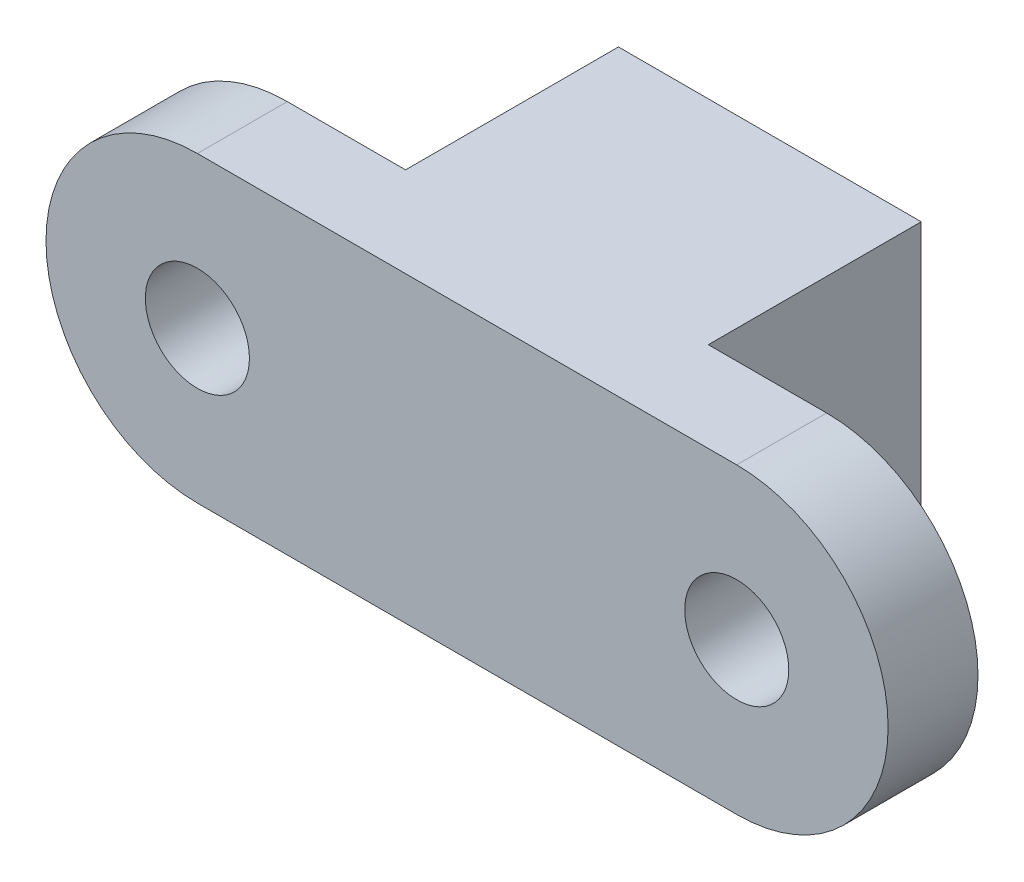
ISO-10303-21;
HEADER;
FILE_DESCRIPTION(('STEP AP214'),'2;1');
FILE_NAME('part.step','',(''),(''),'','','');
FILE_SCHEMA(('AUTOMOTIVE_DESIGN { 1 0 10303 214 1 1 1 1 }'));
ENDSEC;
DATA;
#1=APPLICATION_CONTEXT('core data for automotive mechanical design processes');
#2=APPLICATION_PROTOCOL_DEFINITION('international standard','automotive_design',2000,#1);
#3=PRODUCT_CONTEXT('',#1,'mechanical');
#4=PRODUCT('Part','Part','',(#3));
#5=PRODUCT_RELATED_PRODUCT_CATEGORY('part','',(#4));
#6=PRODUCT_DEFINITION_FORMATION('','',#4);
#7=PRODUCT_DEFINITION_CONTEXT('part definition',#1,'design');
#8=PRODUCT_DEFINITION('design','',#6,#7);
#9=PRODUCT_DEFINITION_SHAPE('','',#8);
#10=(LENGTH_UNIT() NAMED_UNIT(*) SI_UNIT(.MILLI.,.METRE.));
#11=(NAMED_UNIT(*) PLANE_ANGLE_UNIT() SI_UNIT($,.RADIAN.));
#12=(NAMED_UNIT(*) SI_UNIT($,.STERADIAN.) SOLID_ANGLE_UNIT());
#13=UNCERTAINTY_MEASURE_WITH_UNIT(LENGTH_MEASURE(1.E-05),#10,'distance_accuracy_value','');
#14=(GEOMETRIC_REPRESENTATION_CONTEXT(3) GLOBAL_UNCERTAINTY_ASSIGNED_CONTEXT((#13)) GLOBAL_UNIT_ASSIGNED_CONTEXT((#10,
#11,#12)) REPRESENTATION_CONTEXT('',''));
#15=CARTESIAN_POINT('',(0.,0.,0.));
#16=DIRECTION('',(0.,0.,1.));
#17=DIRECTION('',(1.,0.,0.));
#18=AXIS2_PLACEMENT_3D('',#15,#16,#17);
#19=CARTESIAN_POINT('',(0.,-32.,19.));
#20=DIRECTION('',(0.,1.,0.));
#21=DIRECTION('',(0.,0.,1.));
#22=AXIS2_PLACEMENT_3D('',#19,#20,#21);
#23=PLANE('',#22);
#24=DIRECTION('',(0.,0.,-1.));
#25=VECTOR('',#24,1.);
#26=CARTESIAN_POINT('',(38.,-32.,6.));
#27=LINE('',#26,#25);
#28=CARTESIAN_POINT('',(38.,-32.,6.));
#29=VERTEX_POINT('',#28);
#30=CARTESIAN_POINT('',(38.,-32.,-45.));
#31=VERTEX_POINT('',#30);
#32=EDGE_CURVE('E122',#29,#31,#27,.T.);
#33=ORIENTED_EDGE('',*,*,#32,.F.);
#34=DIRECTION('',(1.,0.,0.));
#35=VECTOR('',#34,1.);
#36=CARTESIAN_POINT('',(38.,-32.,6.));
#37=LINE('',#36,#35);
#38=CARTESIAN_POINT('',(76.,-32.,6.));
#39=VERTEX_POINT('',#38);
#40=EDGE_CURVE('E157',#29,#39,#37,.T.);
#41=ORIENTED_EDGE('',*,*,#40,.T.);
#42=DIRECTION('',(0.,0.,-1.));
#43=VECTOR('',#42,1.);
#44=CARTESIAN_POINT('',(76.,-32.,6.));
#45=LINE('',#44,#43);
#46=CARTESIAN_POINT('',(76.,-32.,-45.));
#47=VERTEX_POINT('',#46);
#48=EDGE_CURVE('E233',#39,#47,#45,.T.);
#49=ORIENTED_EDGE('',*,*,#48,.T.);
#50=DIRECTION('',(-1.,0.,0.));
#51=VECTOR('',#50,1.);
#52=CARTESIAN_POINT('',(25.,-32.,-45.));
#53=LINE('',#52,#51);
#54=CARTESIAN_POINT('',(89.,-32.,-45.));
#55=VERTEX_POINT('',#54);
#56=EDGE_CURVE('E143',#55,#47,#53,.T.);
#57=ORIENTED_EDGE('',*,*,#56,.F.);
#58=DIRECTION('',(0.,0.,1.));
#59=VECTOR('',#58,1.);
#60=CARTESIAN_POINT('',(89.,-32.,-45.));
#61=LINE('',#60,#59);
#62=CARTESIAN_POINT('',(89.,-32.,0.));
#63=VERTEX_POINT('',#62);
#64=EDGE_CURVE('E162',#55,#63,#61,.T.);
#65=ORIENTED_EDGE('',*,*,#64,.T.);
#66=DIRECTION('',(1.,0.,0.));
#67=VECTOR('',#66,1.);
#68=CARTESIAN_POINT('',(0.,-32.,0.));
#69=LINE('',#68,#67);
#70=CARTESIAN_POINT('',(114.,-32.,0.));
#71=VERTEX_POINT('',#70);
#72=EDGE_CURVE('E194',#63,#71,#69,.T.);
#73=ORIENTED_EDGE('',*,*,#72,.T.);
#74=DIRECTION('',(0.,0.,-1.));
#75=VECTOR('',#74,1.);
#76=CARTESIAN_POINT('',(114.,-32.,19.));
#77=LINE('',#76,#75);
#78=CARTESIAN_POINT('',(114.,-32.,19.));
#79=VERTEX_POINT('',#78);
#80=EDGE_CURVE('E47',#79,#71,#77,.T.);
#81=ORIENTED_EDGE('',*,*,#80,.F.);
#82=DIRECTION('',(1.,0.,0.));
#83=VECTOR('',#82,1.);
#84=CARTESIAN_POINT('',(0.,-32.,19.));
#85=LINE('',#84,#83);
#86=CARTESIAN_POINT('',(0.,-32.,19.));
#87=VERTEX_POINT('',#86);
#88=EDGE_CURVE('E184',#87,#79,#85,.T.);
#89=ORIENTED_EDGE('',*,*,#88,.F.);
#90=DIRECTION('',(0.,0.,-1.));
#91=VECTOR('',#90,1.);
#92=CARTESIAN_POINT('',(0.,-32.,19.));
#93=LINE('',#92,#91);
#94=CARTESIAN_POINT('',(0.,-32.,0.));
#95=VERTEX_POINT('',#94);
#96=EDGE_CURVE('E11',#87,#95,#93,.T.);
#97=ORIENTED_EDGE('',*,*,#96,.T.);
#98=CARTESIAN_POINT('',(25.,-32.,0.));
#99=VERTEX_POINT('',#98);
#100=EDGE_CURVE('E195',#95,#99,#69,.T.);
#101=ORIENTED_EDGE('',*,*,#100,.T.);
#102=DIRECTION('',(0.,0.,1.));
#103=VECTOR('',#102,1.);
#104=CARTESIAN_POINT('',(25.,-32.,-45.));
#105=LINE('',#104,#103);
#106=CARTESIAN_POINT('',(25.,-32.,-45.));
#107=VERTEX_POINT('',#106);
#108=EDGE_CURVE('E141',#107,#99,#105,.T.);
#109=ORIENTED_EDGE('',*,*,#108,.F.);
#110=EDGE_CURVE('E135',#31,#107,#53,.T.);
#111=ORIENTED_EDGE('',*,*,#110,.F.);
#112=EDGE_LOOP('',(#33,#41,#49,#57,#65,#73,#81,#89,#97,#101,#109,#111));
#113=FACE_BOUND('',#112,.T.);
#114=ADVANCED_FACE('F39',(#113),#23,.F.);
#115=CARTESIAN_POINT('',(0.,0.,-45.));
#116=DIRECTION('',(0.,0.,1.));
#117=DIRECTION('',(1.,0.,0.));
#118=AXIS2_PLACEMENT_3D('',#115,#116,#117);
#119=PLANE('',#118);
#120=DIRECTION('',(0.,1.,0.));
#121=VECTOR('',#120,1.);
#122=CARTESIAN_POINT('',(38.,-32.,-45.));
#123=LINE('',#122,#121);
#124=CARTESIAN_POINT('',(38.,19.,-45.));
#125=VERTEX_POINT('',#124);
#126=EDGE_CURVE('E125',#31,#125,#123,.T.);
#127=ORIENTED_EDGE('',*,*,#126,.F.);
#128=ORIENTED_EDGE('',*,*,#110,.T.);
#129=DIRECTION('',(0.,1.,0.));
#130=VECTOR('',#129,1.);
#131=CARTESIAN_POINT('',(25.,32.,-45.));
#132=LINE('',#131,#130);
#133=CARTESIAN_POINT('',(25.,32.,-45.));
#134=VERTEX_POINT('',#133);
#135=EDGE_CURVE('E147',#107,#134,#132,.T.);
#136=ORIENTED_EDGE('',*,*,#135,.T.);
#137=DIRECTION('',(1.,0.,0.));
#138=VECTOR('',#137,1.);
#139=CARTESIAN_POINT('',(89.,32.,-45.));
#140=LINE('',#139,#138);
#141=CARTESIAN_POINT('',(89.,32.,-45.));
#142=VERTEX_POINT('',#141);
#143=EDGE_CURVE('E148',#134,#142,#140,.T.);
#144=ORIENTED_EDGE('',*,*,#143,.T.);
#145=DIRECTION('',(0.,-1.,0.));
#146=VECTOR('',#145,1.);
#147=CARTESIAN_POINT('',(89.,32.,-45.));
#148=LINE('',#147,#146);
#149=EDGE_CURVE('E144',#142,#55,#148,.T.);
#150=ORIENTED_EDGE('',*,*,#149,.T.);
#151=ORIENTED_EDGE('',*,*,#56,.T.);
#152=DIRECTION('',(0.,1.,0.));
#153=VECTOR('',#152,1.);
#154=CARTESIAN_POINT('',(76.,-32.,-45.));
#155=LINE('',#154,#153);
#156=CARTESIAN_POINT('',(76.,19.,-45.));
#157=VERTEX_POINT('',#156);
#158=EDGE_CURVE('E231',#47,#157,#155,.T.);
#159=ORIENTED_EDGE('',*,*,#158,.T.);
#160=DIRECTION('',(1.,0.,0.));
#161=VECTOR('',#160,1.);
#162=CARTESIAN_POINT('',(38.,19.,-45.));
#163=LINE('',#162,#161);
#164=EDGE_CURVE('E138',#125,#157,#163,.T.);
#165=ORIENTED_EDGE('',*,*,#164,.F.);
#166=EDGE_LOOP('',(#127,#128,#136,#144,#150,#151,#159,#165));
#167=FACE_BOUND('',#166,.T.);
#168=ADVANCED_FACE('F134',(#167),#119,.F.);
#169=CARTESIAN_POINT('',(0.,0.,0.));
#170=DIRECTION('',(0.,0.,1.));
#171=DIRECTION('',(1.,0.,0.));
#172=AXIS2_PLACEMENT_3D('',#169,#170,#171);
#173=PLANE('',#172);
#174=CARTESIAN_POINT('',(0.,0.,0.));
#175=DIRECTION('',(0.,0.,1.));
#176=DIRECTION('',(1.,0.,0.));
#177=AXIS2_PLACEMENT_3D('',#174,#175,#176);
#178=CIRCLE('',#177,11.);
#179=CARTESIAN_POINT('',(11.,0.,0.));
#180=VERTEX_POINT('',#179);
#181=EDGE_CURVE('E172',#180,#180,#178,.T.);
#182=ORIENTED_EDGE('',*,*,#181,.T.);
#183=EDGE_LOOP('',(#182));
#184=FACE_BOUND('',#183,.T.);
#185=DIRECTION('',(0.,1.,0.));
#186=VECTOR('',#185,1.);
#187=CARTESIAN_POINT('',(25.,32.,0.));
#188=LINE('',#187,#186);
#189=CARTESIAN_POINT('',(25.,32.,0.));
#190=VERTEX_POINT('',#189);
#191=EDGE_CURVE('E62',#99,#190,#188,.T.);
#192=ORIENTED_EDGE('',*,*,#191,.F.);
#193=ORIENTED_EDGE('',*,*,#100,.F.);
#194=CARTESIAN_POINT('',(0.,0.,0.));
#195=DIRECTION('',(0.,0.,1.));
#196=DIRECTION('',(1.,0.,0.));
#197=AXIS2_PLACEMENT_3D('',#194,#195,#196);
#198=CIRCLE('',#197,32.);
#199=CARTESIAN_POINT('',(0.,32.,0.));
#200=VERTEX_POINT('',#199);
#201=EDGE_CURVE('E178',#200,#95,#198,.T.);
#202=ORIENTED_EDGE('',*,*,#201,.F.);
#203=DIRECTION('',(-1.,0.,0.));
#204=VECTOR('',#203,1.);
#205=CARTESIAN_POINT('',(0.,32.,0.));
#206=LINE('',#205,#204);
#207=EDGE_CURVE('E199',#190,#200,#206,.T.);
#208=ORIENTED_EDGE('',*,*,#207,.F.);
#209=EDGE_LOOP('',(#192,#193,#202,#208));
#210=FACE_BOUND('',#209,.T.);
#211=ADVANCED_FACE('F250',(#184,#210),#173,.F.);
#212=CARTESIAN_POINT('',(114.,0.,0.));
#213=DIRECTION('',(0.,0.,1.));
#214=DIRECTION('',(1.,0.,0.));
#215=AXIS2_PLACEMENT_3D('',#212,#213,#214);
#216=CIRCLE('',#215,11.);
#217=CARTESIAN_POINT('',(125.,0.,0.));
#218=VERTEX_POINT('',#217);
#219=EDGE_CURVE('E168',#218,#218,#216,.T.);
#220=ORIENTED_EDGE('',*,*,#219,.T.);
#221=EDGE_LOOP('',(#220));
#222=FACE_BOUND('',#221,.T.);
#223=DIRECTION('',(0.,-1.,0.));
#224=VECTOR('',#223,1.);
#225=CARTESIAN_POINT('',(89.,32.,0.));
#226=LINE('',#225,#224);
#227=CARTESIAN_POINT('',(89.,32.,0.));
#228=VERTEX_POINT('',#227);
#229=EDGE_CURVE('E154',#228,#63,#226,.T.);
#230=ORIENTED_EDGE('',*,*,#229,.F.);
#231=CARTESIAN_POINT('',(114.,32.,0.));
#232=VERTEX_POINT('',#231);
#233=EDGE_CURVE('E185',#232,#228,#206,.T.);
#234=ORIENTED_EDGE('',*,*,#233,.F.);
#235=CARTESIAN_POINT('',(114.,0.,0.));
#236=DIRECTION('',(0.,0.,1.));
#237=DIRECTION('',(1.,0.,0.));
#238=AXIS2_PLACEMENT_3D('',#235,#236,#237);
#239=CIRCLE('',#238,32.);
#240=EDGE_CURVE('E197',#71,#232,#239,.T.);
#241=ORIENTED_EDGE('',*,*,#240,.F.);
#242=ORIENTED_EDGE('',*,*,#72,.F.);
#243=EDGE_LOOP('',(#230,#234,#241,#242));
#244=FACE_BOUND('',#243,.T.);
#245=ADVANCED_FACE('F215',(#222,#244),#173,.F.);
#246=CARTESIAN_POINT('',(0.,0.,19.));
#247=DIRECTION('',(0.,0.,1.));
#248=DIRECTION('',(1.,0.,0.));
#249=AXIS2_PLACEMENT_3D('',#246,#247,#248);
#250=PLANE('',#249);
#251=CARTESIAN_POINT('',(0.,0.,19.));
#252=DIRECTION('',(0.,0.,1.));
#253=DIRECTION('',(1.,0.,0.));
#254=AXIS2_PLACEMENT_3D('',#251,#252,#253);
#255=CIRCLE('',#254,11.);
#256=CARTESIAN_POINT('',(11.,0.,19.));
#257=VERTEX_POINT('',#256);
#258=EDGE_CURVE('E175',#257,#257,#255,.T.);
#259=ORIENTED_EDGE('',*,*,#258,.F.);
#260=EDGE_LOOP('',(#259));
#261=FACE_BOUND('',#260,.T.);
#262=CARTESIAN_POINT('',(0.,0.,19.));
#263=DIRECTION('',(0.,0.,1.));
#264=DIRECTION('',(1.,0.,0.));
#265=AXIS2_PLACEMENT_3D('',#262,#263,#264);
#266=CIRCLE('',#265,32.);
#267=CARTESIAN_POINT('',(0.,32.,19.));
#268=VERTEX_POINT('',#267);
#269=EDGE_CURVE('E181',#268,#87,#266,.T.);
#270=ORIENTED_EDGE('',*,*,#269,.T.);
#271=ORIENTED_EDGE('',*,*,#88,.T.);
#272=CARTESIAN_POINT('',(114.,0.,19.));
#273=DIRECTION('',(0.,0.,1.));
#274=DIRECTION('',(1.,0.,0.));
#275=AXIS2_PLACEMENT_3D('',#272,#273,#274);
#276=CIRCLE('',#275,32.);
#277=CARTESIAN_POINT('',(114.,32.,19.));
#278=VERTEX_POINT('',#277);
#279=EDGE_CURVE('E187',#79,#278,#276,.T.);
#280=ORIENTED_EDGE('',*,*,#279,.T.);
#281=DIRECTION('',(-1.,0.,0.));
#282=VECTOR('',#281,1.);
#283=CARTESIAN_POINT('',(0.,32.,19.));
#284=LINE('',#283,#282);
#285=EDGE_CURVE('E189',#278,#268,#284,.T.);
#286=ORIENTED_EDGE('',*,*,#285,.T.);
#287=EDGE_LOOP('',(#270,#271,#280,#286));
#288=FACE_BOUND('',#287,.T.);
#289=CARTESIAN_POINT('',(114.,0.,19.));
#290=DIRECTION('',(0.,0.,1.));
#291=DIRECTION('',(1.,0.,0.));
#292=AXIS2_PLACEMENT_3D('',#289,#290,#291);
#293=CIRCLE('',#292,11.);
#294=CARTESIAN_POINT('',(125.,0.,19.));
#295=VERTEX_POINT('',#294);
#296=EDGE_CURVE('E169',#295,#295,#293,.T.);
#297=ORIENTED_EDGE('',*,*,#296,.F.);
#298=EDGE_LOOP('',(#297));
#299=FACE_BOUND('',#298,.T.);
#300=ADVANCED_FACE('F261',(#261,#288,#299),#250,.T.);
#301=CARTESIAN_POINT('',(0.,0.,19.));
#302=DIRECTION('',(0.,0.,-1.));
#303=DIRECTION('',(-1.,0.,0.));
#304=AXIS2_PLACEMENT_3D('',#301,#302,#303);
#305=CYLINDRICAL_SURFACE('',#304,32.);
#306=ORIENTED_EDGE('',*,*,#201,.T.);
#307=ORIENTED_EDGE('',*,*,#96,.F.);
#308=ORIENTED_EDGE('',*,*,#269,.F.);
#309=DIRECTION('',(0.,0.,-1.));
#310=VECTOR('',#309,1.);
#311=CARTESIAN_POINT('',(0.,32.,19.));
#312=LINE('',#311,#310);
#313=EDGE_CURVE('E191',#268,#200,#312,.T.);
#314=ORIENTED_EDGE('',*,*,#313,.T.);
#315=EDGE_LOOP('',(#306,#307,#308,#314));
#316=FACE_BOUND('',#315,.T.);
#317=ADVANCED_FACE('F41',(#316),#305,.T.);
#318=CARTESIAN_POINT('',(114.,0.,19.));
#319=DIRECTION('',(0.,0.,-1.));
#320=DIRECTION('',(-1.,0.,0.));
#321=AXIS2_PLACEMENT_3D('',#318,#319,#320);
#322=CYLINDRICAL_SURFACE('',#321,32.);
#323=ORIENTED_EDGE('',*,*,#240,.T.);
#324=DIRECTION('',(0.,0.,-1.));
#325=VECTOR('',#324,1.);
#326=CARTESIAN_POINT('',(114.,32.,19.));
#327=LINE('',#326,#325);
#328=EDGE_CURVE('E204',#278,#232,#327,.T.);
#329=ORIENTED_EDGE('',*,*,#328,.F.);
#330=ORIENTED_EDGE('',*,*,#279,.F.);
#331=ORIENTED_EDGE('',*,*,#80,.T.);
#332=EDGE_LOOP('',(#323,#329,#330,#331));
#333=FACE_BOUND('',#332,.T.);
#334=ADVANCED_FACE('F211',(#333),#322,.T.);
#335=CARTESIAN_POINT('',(0.,32.,19.));
#336=DIRECTION('',(0.,-1.,0.));
#337=DIRECTION('',(0.,0.,-1.));
#338=AXIS2_PLACEMENT_3D('',#335,#336,#337);
#339=PLANE('',#338);
#340=ORIENTED_EDGE('',*,*,#233,.T.);
#341=DIRECTION('',(0.,0.,1.));
#342=VECTOR('',#341,1.);
#343=CARTESIAN_POINT('',(89.,32.,-45.));
#344=LINE('',#343,#342);
#345=EDGE_CURVE('E165',#142,#228,#344,.T.);
#346=ORIENTED_EDGE('',*,*,#345,.F.);
#347=ORIENTED_EDGE('',*,*,#143,.F.);
#348=DIRECTION('',(0.,0.,1.));
#349=VECTOR('',#348,1.);
#350=CARTESIAN_POINT('',(25.,32.,-45.));
#351=LINE('',#350,#349);
#352=EDGE_CURVE('E153',#134,#190,#351,.T.);
#353=ORIENTED_EDGE('',*,*,#352,.T.);
#354=ORIENTED_EDGE('',*,*,#207,.T.);
#355=ORIENTED_EDGE('',*,*,#313,.F.);
#356=ORIENTED_EDGE('',*,*,#285,.F.);
#357=ORIENTED_EDGE('',*,*,#328,.T.);
#358=EDGE_LOOP('',(#340,#346,#347,#353,#354,#355,#356,#357));
#359=FACE_BOUND('',#358,.T.);
#360=ADVANCED_FACE('F218',(#359),#339,.F.);
#361=CARTESIAN_POINT('',(0.,0.,19.));
#362=DIRECTION('',(0.,0.,-1.));
#363=DIRECTION('',(-1.,0.,0.));
#364=AXIS2_PLACEMENT_3D('',#361,#362,#363);
#365=CYLINDRICAL_SURFACE('',#364,11.);
#366=ORIENTED_EDGE('',*,*,#258,.T.);
#367=EDGE_LOOP('',(#366));
#368=FACE_BOUND('',#367,.T.);
#369=ORIENTED_EDGE('',*,*,#181,.F.);
#370=EDGE_LOOP('',(#369));
#371=FACE_BOUND('',#370,.T.);
#372=ADVANCED_FACE('F257',(#368,#371),#365,.F.);
#373=CARTESIAN_POINT('',(114.,0.,19.));
#374=DIRECTION('',(0.,0.,-1.));
#375=DIRECTION('',(-1.,0.,0.));
#376=AXIS2_PLACEMENT_3D('',#373,#374,#375);
#377=CYLINDRICAL_SURFACE('',#376,11.);
#378=ORIENTED_EDGE('',*,*,#296,.T.);
#379=EDGE_LOOP('',(#378));
#380=FACE_BOUND('',#379,.T.);
#381=ORIENTED_EDGE('',*,*,#219,.F.);
#382=EDGE_LOOP('',(#381));
#383=FACE_BOUND('',#382,.T.);
#384=ADVANCED_FACE('F267',(#380,#383),#377,.F.);
#385=CARTESIAN_POINT('',(89.,32.,-45.));
#386=DIRECTION('',(-1.,0.,0.));
#387=DIRECTION('',(0.,-1.,0.));
#388=AXIS2_PLACEMENT_3D('',#385,#386,#387);
#389=PLANE('',#388);
#390=ORIENTED_EDGE('',*,*,#229,.T.);
#391=ORIENTED_EDGE('',*,*,#64,.F.);
#392=ORIENTED_EDGE('',*,*,#149,.F.);
#393=ORIENTED_EDGE('',*,*,#345,.T.);
#394=EDGE_LOOP('',(#390,#391,#392,#393));
#395=FACE_BOUND('',#394,.T.);
#396=ADVANCED_FACE('F222',(#395),#389,.F.);
#397=CARTESIAN_POINT('',(25.,32.,-45.));
#398=DIRECTION('',(1.,0.,0.));
#399=DIRECTION('',(0.,0.,-1.));
#400=AXIS2_PLACEMENT_3D('',#397,#398,#399);
#401=PLANE('',#400);
#402=ORIENTED_EDGE('',*,*,#191,.T.);
#403=ORIENTED_EDGE('',*,*,#352,.F.);
#404=ORIENTED_EDGE('',*,*,#135,.F.);
#405=ORIENTED_EDGE('',*,*,#108,.T.);
#406=EDGE_LOOP('',(#402,#403,#404,#405));
#407=FACE_BOUND('',#406,.T.);
#408=ADVANCED_FACE('F274',(#407),#401,.F.);
#409=CARTESIAN_POINT('',(38.,19.,-45.));
#410=DIRECTION('',(0.,0.707106781186547,0.707106781186548));
#411=DIRECTION('',(0.,-0.707106781186548,0.707106781186547));
#412=AXIS2_PLACEMENT_3D('',#409,#410,#411);
#413=PLANE('',#412);
#414=DIRECTION('',(0.,-0.707106781186548,0.707106781186547));
#415=VECTOR('',#414,1.);
#416=CARTESIAN_POINT('',(76.,19.,-45.));
#417=LINE('',#416,#415);
#418=EDGE_CURVE('E54',#157,#39,#417,.T.);
#419=ORIENTED_EDGE('',*,*,#418,.T.);
#420=ORIENTED_EDGE('',*,*,#40,.F.);
#421=DIRECTION('',(0.,-0.707106781186548,0.707106781186547));
#422=VECTOR('',#421,1.);
#423=CARTESIAN_POINT('',(38.,19.,-45.));
#424=LINE('',#423,#422);
#425=EDGE_CURVE('E127',#125,#29,#424,.T.);
#426=ORIENTED_EDGE('',*,*,#425,.F.);
#427=ORIENTED_EDGE('',*,*,#164,.T.);
#428=EDGE_LOOP('',(#419,#420,#426,#427));
#429=FACE_BOUND('',#428,.T.);
#430=ADVANCED_FACE('F242',(#429),#413,.F.);
#431=CARTESIAN_POINT('',(38.,0.,0.));
#432=DIRECTION('',(1.,0.,0.));
#433=DIRECTION('',(0.,0.,-1.));
#434=AXIS2_PLACEMENT_3D('',#431,#432,#433);
#435=PLANE('',#434);
#436=ORIENTED_EDGE('',*,*,#32,.T.);
#437=ORIENTED_EDGE('',*,*,#126,.T.);
#438=ORIENTED_EDGE('',*,*,#425,.T.);
#439=EDGE_LOOP('',(#436,#437,#438));
#440=FACE_BOUND('',#439,.T.);
#441=ADVANCED_FACE('F124',(#440),#435,.T.);
#442=CARTESIAN_POINT('',(76.,0.,0.));
#443=DIRECTION('',(1.,0.,0.));
#444=DIRECTION('',(0.,0.,-1.));
#445=AXIS2_PLACEMENT_3D('',#442,#443,#444);
#446=PLANE('',#445);
#447=ORIENTED_EDGE('',*,*,#48,.F.);
#448=ORIENTED_EDGE('',*,*,#418,.F.);
#449=ORIENTED_EDGE('',*,*,#158,.F.);
#450=EDGE_LOOP('',(#447,#448,#449));
#451=FACE_BOUND('',#450,.T.);
#452=ADVANCED_FACE('F236',(#451),#446,.F.);
#453=CLOSED_SHELL('',(#114,#168,#211,#245,#300,#317,#334,#360,#372,#384,#396,#408,#430,#441,#452));
#454=MANIFOLD_SOLID_BREP('B2',#453);
#455=ADVANCED_BREP_SHAPE_REPRESENTATION('',(#18,#454),#14);
#456=SHAPE_DEFINITION_REPRESENTATION(#9,#455);
ENDSEC;
END-ISO-10303-21;
